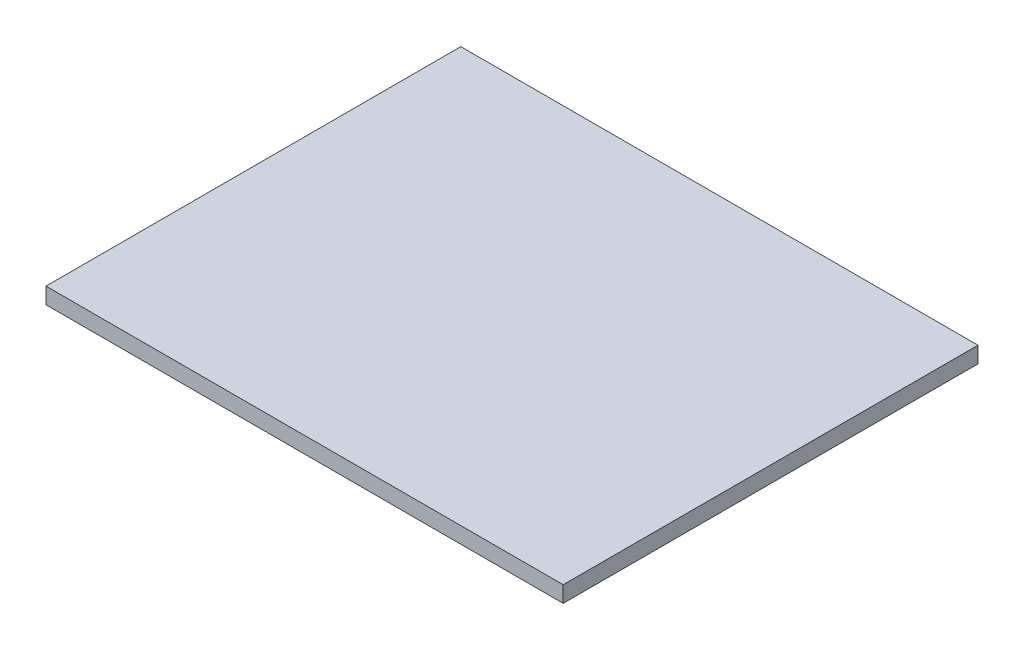
ISO-10303-21;
HEADER;
FILE_DESCRIPTION(('STEP AP214'),'2;1');
FILE_NAME('part.step','',(''),(''),'','','');
FILE_SCHEMA(('AUTOMOTIVE_DESIGN { 1 0 10303 214 1 1 1 1 }'));
ENDSEC;
DATA;
#1=APPLICATION_CONTEXT('core data for automotive mechanical design processes');
#2=APPLICATION_PROTOCOL_DEFINITION('international standard','automotive_design',2000,#1);
#3=PRODUCT_CONTEXT('',#1,'mechanical');
#4=PRODUCT('Part','Part','',(#3));
#5=PRODUCT_RELATED_PRODUCT_CATEGORY('part','',(#4));
#6=PRODUCT_DEFINITION_FORMATION('','',#4);
#7=PRODUCT_DEFINITION_CONTEXT('part definition',#1,'design');
#8=PRODUCT_DEFINITION('design','',#6,#7);
#9=PRODUCT_DEFINITION_SHAPE('','',#8);
#10=(LENGTH_UNIT() NAMED_UNIT(*) SI_UNIT(.MILLI.,.METRE.));
#11=(NAMED_UNIT(*) PLANE_ANGLE_UNIT() SI_UNIT($,.RADIAN.));
#12=(NAMED_UNIT(*) SI_UNIT($,.STERADIAN.) SOLID_ANGLE_UNIT());
#13=UNCERTAINTY_MEASURE_WITH_UNIT(LENGTH_MEASURE(1.E-05),#10,'distance_accuracy_value','');
#14=(GEOMETRIC_REPRESENTATION_CONTEXT(3) GLOBAL_UNCERTAINTY_ASSIGNED_CONTEXT((#13)) GLOBAL_UNIT_ASSIGNED_CONTEXT((#10,
#11,#12)) REPRESENTATION_CONTEXT('',''));
#15=CARTESIAN_POINT('',(0.,0.,0.));
#16=DIRECTION('',(0.,0.,1.));
#17=DIRECTION('',(1.,0.,0.));
#18=AXIS2_PLACEMENT_3D('',#15,#16,#17);
#19=CARTESIAN_POINT('',(0.,0.,0.));
#20=DIRECTION('',(0.,-1.,0.));
#21=DIRECTION('',(0.,0.,-1.));
#22=AXIS2_PLACEMENT_3D('',#19,#20,#21);
#23=PLANE('',#22);
#24=DIRECTION('',(0.,0.,1.));
#25=VECTOR('',#24,1.);
#26=CARTESIAN_POINT('',(-0.762000000000004,0.,0.762000000000004));
#27=LINE('',#26,#25);
#28=CARTESIAN_POINT('',(-0.762000000000004,0.,-18.796));
#29=VERTEX_POINT('',#28);
#30=CARTESIAN_POINT('',(-0.762000000000004,0.,0.762000000000004));
#31=VERTEX_POINT('',#30);
#32=EDGE_CURVE('E182',#29,#31,#27,.T.);
#33=ORIENTED_EDGE('',*,*,#32,.F.);
#34=DIRECTION('',(-1.,0.,0.));
#35=VECTOR('',#34,1.);
#36=CARTESIAN_POINT('',(-0.762000000000004,0.,-18.796));
#37=LINE('',#36,#35);
#38=CARTESIAN_POINT('',(23.622,0.,-18.796));
#39=VERTEX_POINT('',#38);
#40=EDGE_CURVE('E80',#39,#29,#37,.T.);
#41=ORIENTED_EDGE('',*,*,#40,.F.);
#42=DIRECTION('',(0.,0.,-1.));
#43=VECTOR('',#42,1.);
#44=CARTESIAN_POINT('',(23.622,0.,0.762000000000004));
#45=LINE('',#44,#43);
#46=CARTESIAN_POINT('',(23.622,0.,0.762000000000004));
#47=VERTEX_POINT('',#46);
#48=EDGE_CURVE('E199',#47,#39,#45,.T.);
#49=ORIENTED_EDGE('',*,*,#48,.F.);
#50=DIRECTION('',(1.,0.,0.));
#51=VECTOR('',#50,1.);
#52=CARTESIAN_POINT('',(-0.762000000000004,0.,0.762000000000004));
#53=LINE('',#52,#51);
#54=EDGE_CURVE('E185',#31,#47,#53,.T.);
#55=ORIENTED_EDGE('',*,*,#54,.F.);
#56=EDGE_LOOP('',(#33,#41,#49,#55));
#57=FACE_BOUND('',#56,.T.);
#58=DIRECTION('',(1.,0.,0.));
#59=VECTOR('',#58,1.);
#60=CARTESIAN_POINT('',(0.,0.,-5.842));
#61=LINE('',#60,#59);
#62=CARTESIAN_POINT('',(0.,0.,-5.842));
#63=VERTEX_POINT('',#62);
#64=CARTESIAN_POINT('',(0.761999999999998,0.,-5.842));
#65=VERTEX_POINT('',#64);
#66=EDGE_CURVE('E395',#63,#65,#61,.T.);
#67=ORIENTED_EDGE('',*,*,#66,.F.);
#68=DIRECTION('',(0.,0.,-1.));
#69=VECTOR('',#68,1.);
#70=CARTESIAN_POINT('',(0.,0.,0.));
#71=LINE('',#70,#69);
#72=CARTESIAN_POINT('',(0.,0.,0.));
#73=VERTEX_POINT('',#72);
#74=EDGE_CURVE('E180',#73,#63,#71,.T.);
#75=ORIENTED_EDGE('',*,*,#74,.F.);
#76=DIRECTION('',(-1.,0.,0.));
#77=VECTOR('',#76,1.);
#78=CARTESIAN_POINT('',(0.,0.,0.));
#79=LINE('',#78,#77);
#80=CARTESIAN_POINT('',(22.86,0.,0.));
#81=VERTEX_POINT('',#80);
#82=EDGE_CURVE('E176',#81,#73,#79,.T.);
#83=ORIENTED_EDGE('',*,*,#82,.F.);
#84=DIRECTION('',(0.,0.,1.));
#85=VECTOR('',#84,1.);
#86=CARTESIAN_POINT('',(22.86,0.,0.));
#87=LINE('',#86,#85);
#88=CARTESIAN_POINT('',(22.86,0.,-18.034));
#89=VERTEX_POINT('',#88);
#90=EDGE_CURVE('E391',#89,#81,#87,.T.);
#91=ORIENTED_EDGE('',*,*,#90,.F.);
#92=DIRECTION('',(1.,0.,0.));
#93=VECTOR('',#92,1.);
#94=CARTESIAN_POINT('',(22.86,0.,-18.034));
#95=LINE('',#94,#93);
#96=CARTESIAN_POINT('',(0.,0.,-18.034));
#97=VERTEX_POINT('',#96);
#98=EDGE_CURVE('E415',#97,#89,#95,.T.);
#99=ORIENTED_EDGE('',*,*,#98,.F.);
#100=DIRECTION('',(0.,0.,-1.));
#101=VECTOR('',#100,1.);
#102=CARTESIAN_POINT('',(0.,0.,-12.192));
#103=LINE('',#102,#101);
#104=CARTESIAN_POINT('',(0.,0.,-12.192));
#105=VERTEX_POINT('',#104);
#106=EDGE_CURVE('E413',#105,#97,#103,.T.);
#107=ORIENTED_EDGE('',*,*,#106,.F.);
#108=DIRECTION('',(-1.,0.,0.));
#109=VECTOR('',#108,1.);
#110=CARTESIAN_POINT('',(0.,0.,-12.192));
#111=LINE('',#110,#109);
#112=CARTESIAN_POINT('',(0.761999999999998,0.,-12.192));
#113=VERTEX_POINT('',#112);
#114=EDGE_CURVE('E411',#113,#105,#111,.T.);
#115=ORIENTED_EDGE('',*,*,#114,.F.);
#116=DIRECTION('',(0.,0.,1.));
#117=VECTOR('',#116,1.);
#118=CARTESIAN_POINT('',(0.761999999999998,0.,-12.192));
#119=LINE('',#118,#117);
#120=CARTESIAN_POINT('',(0.761999999999999,0.,-17.272));
#121=VERTEX_POINT('',#120);
#122=EDGE_CURVE('E409',#121,#113,#119,.T.);
#123=ORIENTED_EDGE('',*,*,#122,.F.);
#124=DIRECTION('',(-1.,0.,0.));
#125=VECTOR('',#124,1.);
#126=CARTESIAN_POINT('',(0.761999999999999,0.,-17.272));
#127=LINE('',#126,#125);
#128=CARTESIAN_POINT('',(22.098,0.,-17.272));
#129=VERTEX_POINT('',#128);
#130=EDGE_CURVE('E407',#129,#121,#127,.T.);
#131=ORIENTED_EDGE('',*,*,#130,.F.);
#132=DIRECTION('',(0.,0.,-1.));
#133=VECTOR('',#132,1.);
#134=CARTESIAN_POINT('',(22.098,0.,-17.272));
#135=LINE('',#134,#133);
#136=CARTESIAN_POINT('',(22.098,0.,-0.761999999999997));
#137=VERTEX_POINT('',#136);
#138=EDGE_CURVE('E405',#137,#129,#135,.T.);
#139=ORIENTED_EDGE('',*,*,#138,.F.);
#140=DIRECTION('',(1.,0.,0.));
#141=VECTOR('',#140,1.);
#142=CARTESIAN_POINT('',(22.098,0.,-0.761999999999997));
#143=LINE('',#142,#141);
#144=CARTESIAN_POINT('',(0.761999999999998,0.,-0.762));
#145=VERTEX_POINT('',#144);
#146=EDGE_CURVE('E403',#145,#137,#143,.T.);
#147=ORIENTED_EDGE('',*,*,#146,.F.);
#148=DIRECTION('',(0.,0.,1.));
#149=VECTOR('',#148,1.);
#150=CARTESIAN_POINT('',(0.761999999999998,0.,-5.842));
#151=LINE('',#150,#149);
#152=EDGE_CURVE('E397',#65,#145,#151,.T.);
#153=ORIENTED_EDGE('',*,*,#152,.F.);
#154=EDGE_LOOP('',(#67,#75,#83,#91,#99,#107,#115,#123,#131,#139,#147,#153));
#155=FACE_BOUND('',#154,.T.);
#156=ADVANCED_FACE('F35',(#57,#155),#23,.T.);
#157=CARTESIAN_POINT('',(-0.762000000000004,0.762,0.762000000000004));
#158=DIRECTION('',(1.,0.,0.));
#159=DIRECTION('',(0.,0.,-1.));
#160=AXIS2_PLACEMENT_3D('',#157,#158,#159);
#161=PLANE('',#160);
#162=ORIENTED_EDGE('',*,*,#32,.T.);
#163=DIRECTION('',(0.,-1.,0.));
#164=VECTOR('',#163,1.);
#165=CARTESIAN_POINT('',(-0.762000000000004,0.762,0.762000000000004));
#166=LINE('',#165,#164);
#167=CARTESIAN_POINT('',(-0.762000000000004,0.762,0.762000000000004));
#168=VERTEX_POINT('',#167);
#169=EDGE_CURVE('E11',#168,#31,#166,.T.);
#170=ORIENTED_EDGE('',*,*,#169,.F.);
#171=DIRECTION('',(0.,0.,1.));
#172=VECTOR('',#171,1.);
#173=CARTESIAN_POINT('',(-0.762000000000004,0.762,0.762000000000004));
#174=LINE('',#173,#172);
#175=CARTESIAN_POINT('',(-0.762000000000004,0.762,-18.796));
#176=VERTEX_POINT('',#175);
#177=EDGE_CURVE('E191',#176,#168,#174,.T.);
#178=ORIENTED_EDGE('',*,*,#177,.F.);
#179=DIRECTION('',(0.,-1.,0.));
#180=VECTOR('',#179,1.);
#181=CARTESIAN_POINT('',(-0.762000000000004,0.762,-18.796));
#182=LINE('',#181,#180);
#183=EDGE_CURVE('E196',#176,#29,#182,.T.);
#184=ORIENTED_EDGE('',*,*,#183,.T.);
#185=EDGE_LOOP('',(#162,#170,#178,#184));
#186=FACE_BOUND('',#185,.T.);
#187=ADVANCED_FACE('F37',(#186),#161,.F.);
#188=CARTESIAN_POINT('',(-0.762000000000004,0.762,0.762000000000004));
#189=DIRECTION('',(0.,0.,-1.));
#190=DIRECTION('',(-1.,0.,0.));
#191=AXIS2_PLACEMENT_3D('',#188,#189,#190);
#192=PLANE('',#191);
#193=ORIENTED_EDGE('',*,*,#54,.T.);
#194=DIRECTION('',(0.,-1.,0.));
#195=VECTOR('',#194,1.);
#196=CARTESIAN_POINT('',(23.622,0.762,0.762000000000004));
#197=LINE('',#196,#195);
#198=CARTESIAN_POINT('',(23.622,0.762,0.762000000000004));
#199=VERTEX_POINT('',#198);
#200=EDGE_CURVE('E43',#199,#47,#197,.T.);
#201=ORIENTED_EDGE('',*,*,#200,.F.);
#202=DIRECTION('',(1.,0.,0.));
#203=VECTOR('',#202,1.);
#204=CARTESIAN_POINT('',(-0.762000000000004,0.762,0.762000000000004));
#205=LINE('',#204,#203);
#206=EDGE_CURVE('E87',#168,#199,#205,.T.);
#207=ORIENTED_EDGE('',*,*,#206,.F.);
#208=ORIENTED_EDGE('',*,*,#169,.T.);
#209=EDGE_LOOP('',(#193,#201,#207,#208));
#210=FACE_BOUND('',#209,.T.);
#211=ADVANCED_FACE('F225',(#210),#192,.F.);
#212=CARTESIAN_POINT('',(23.622,0.762,0.762000000000004));
#213=DIRECTION('',(-1.,0.,0.));
#214=DIRECTION('',(0.,0.,1.));
#215=AXIS2_PLACEMENT_3D('',#212,#213,#214);
#216=PLANE('',#215);
#217=ORIENTED_EDGE('',*,*,#48,.T.);
#218=DIRECTION('',(0.,-1.,0.));
#219=VECTOR('',#218,1.);
#220=CARTESIAN_POINT('',(23.622,0.762,-18.796));
#221=LINE('',#220,#219);
#222=CARTESIAN_POINT('',(23.622,0.762,-18.796));
#223=VERTEX_POINT('',#222);
#224=EDGE_CURVE('E203',#223,#39,#221,.T.);
#225=ORIENTED_EDGE('',*,*,#224,.F.);
#226=DIRECTION('',(0.,0.,-1.));
#227=VECTOR('',#226,1.);
#228=CARTESIAN_POINT('',(23.622,0.762,0.762000000000004));
#229=LINE('',#228,#227);
#230=EDGE_CURVE('E194',#199,#223,#229,.T.);
#231=ORIENTED_EDGE('',*,*,#230,.F.);
#232=ORIENTED_EDGE('',*,*,#200,.T.);
#233=EDGE_LOOP('',(#217,#225,#231,#232));
#234=FACE_BOUND('',#233,.T.);
#235=ADVANCED_FACE('F208',(#234),#216,.F.);
#236=CARTESIAN_POINT('',(-0.762000000000004,0.762,-18.796));
#237=DIRECTION('',(0.,0.,1.));
#238=DIRECTION('',(1.,0.,0.));
#239=AXIS2_PLACEMENT_3D('',#236,#237,#238);
#240=PLANE('',#239);
#241=ORIENTED_EDGE('',*,*,#40,.T.);
#242=ORIENTED_EDGE('',*,*,#183,.F.);
#243=DIRECTION('',(-1.,0.,0.));
#244=VECTOR('',#243,1.);
#245=CARTESIAN_POINT('',(-0.762000000000004,0.762,-18.796));
#246=LINE('',#245,#244);
#247=EDGE_CURVE('E59',#223,#176,#246,.T.);
#248=ORIENTED_EDGE('',*,*,#247,.F.);
#249=ORIENTED_EDGE('',*,*,#224,.T.);
#250=EDGE_LOOP('',(#241,#242,#248,#249));
#251=FACE_BOUND('',#250,.T.);
#252=ADVANCED_FACE('F216',(#251),#240,.F.);
#253=CARTESIAN_POINT('',(0.,0.762,0.));
#254=DIRECTION('',(0.,-1.,0.));
#255=DIRECTION('',(0.,0.,-1.));
#256=AXIS2_PLACEMENT_3D('',#253,#254,#255);
#257=PLANE('',#256);
#258=ORIENTED_EDGE('',*,*,#177,.T.);
#259=ORIENTED_EDGE('',*,*,#206,.T.);
#260=ORIENTED_EDGE('',*,*,#230,.T.);
#261=ORIENTED_EDGE('',*,*,#247,.T.);
#262=EDGE_LOOP('',(#258,#259,#260,#261));
#263=FACE_BOUND('',#262,.T.);
#264=ADVANCED_FACE('F218',(#263),#257,.F.);
#265=CARTESIAN_POINT('',(0.,-0.762,0.));
#266=DIRECTION('',(1.,0.,0.));
#267=DIRECTION('',(0.,0.,-1.));
#268=AXIS2_PLACEMENT_3D('',#265,#266,#267);
#269=PLANE('',#268);
#270=ORIENTED_EDGE('',*,*,#74,.T.);
#271=DIRECTION('',(0.,1.,0.));
#272=VECTOR('',#271,1.);
#273=CARTESIAN_POINT('',(0.,-0.762,-5.842));
#274=LINE('',#273,#272);
#275=CARTESIAN_POINT('',(0.,-0.762,-5.842));
#276=VERTEX_POINT('',#275);
#277=EDGE_CURVE('E161',#276,#63,#274,.T.);
#278=ORIENTED_EDGE('',*,*,#277,.F.);
#279=DIRECTION('',(0.,0.,-1.));
#280=VECTOR('',#279,1.);
#281=CARTESIAN_POINT('',(0.,-0.762,0.));
#282=LINE('',#281,#280);
#283=CARTESIAN_POINT('',(0.,-0.762,0.));
#284=VERTEX_POINT('',#283);
#285=EDGE_CURVE('E168',#284,#276,#282,.T.);
#286=ORIENTED_EDGE('',*,*,#285,.F.);
#287=DIRECTION('',(0.,1.,0.));
#288=VECTOR('',#287,1.);
#289=CARTESIAN_POINT('',(0.,-0.762,0.));
#290=LINE('',#289,#288);
#291=EDGE_CURVE('E389',#284,#73,#290,.T.);
#292=ORIENTED_EDGE('',*,*,#291,.T.);
#293=EDGE_LOOP('',(#270,#278,#286,#292));
#294=FACE_BOUND('',#293,.T.);
#295=ADVANCED_FACE('F178',(#294),#269,.F.);
#296=CARTESIAN_POINT('',(0.,-0.762,-5.842));
#297=DIRECTION('',(0.,0.,1.));
#298=DIRECTION('',(1.,0.,0.));
#299=AXIS2_PLACEMENT_3D('',#296,#297,#298);
#300=PLANE('',#299);
#301=ORIENTED_EDGE('',*,*,#66,.T.);
#302=DIRECTION('',(0.,1.,0.));
#303=VECTOR('',#302,1.);
#304=CARTESIAN_POINT('',(0.761999999999998,-0.762,-5.842));
#305=LINE('',#304,#303);
#306=CARTESIAN_POINT('',(0.761999999999998,-0.762,-5.842));
#307=VERTEX_POINT('',#306);
#308=EDGE_CURVE('E164',#307,#65,#305,.T.);
#309=ORIENTED_EDGE('',*,*,#308,.F.);
#310=DIRECTION('',(1.,0.,0.));
#311=VECTOR('',#310,1.);
#312=CARTESIAN_POINT('',(0.,-0.762,-5.842));
#313=LINE('',#312,#311);
#314=EDGE_CURVE('E157',#276,#307,#313,.T.);
#315=ORIENTED_EDGE('',*,*,#314,.F.);
#316=ORIENTED_EDGE('',*,*,#277,.T.);
#317=EDGE_LOOP('',(#301,#309,#315,#316));
#318=FACE_BOUND('',#317,.T.);
#319=ADVANCED_FACE('F159',(#318),#300,.F.);
#320=CARTESIAN_POINT('',(0.761999999999998,-0.762,-5.842));
#321=DIRECTION('',(-1.,0.,0.));
#322=DIRECTION('',(0.,0.,1.));
#323=AXIS2_PLACEMENT_3D('',#320,#321,#322);
#324=PLANE('',#323);
#325=ORIENTED_EDGE('',*,*,#152,.T.);
#326=DIRECTION('',(0.,1.,0.));
#327=VECTOR('',#326,1.);
#328=CARTESIAN_POINT('',(0.761999999999998,-0.762,-0.762));
#329=LINE('',#328,#327);
#330=CARTESIAN_POINT('',(0.761999999999998,-0.762,-0.762));
#331=VERTEX_POINT('',#330);
#332=EDGE_CURVE('E187',#331,#145,#329,.T.);
#333=ORIENTED_EDGE('',*,*,#332,.F.);
#334=DIRECTION('',(0.,0.,1.));
#335=VECTOR('',#334,1.);
#336=CARTESIAN_POINT('',(0.761999999999998,-0.762,-5.842));
#337=LINE('',#336,#335);
#338=EDGE_CURVE('E167',#307,#331,#337,.T.);
#339=ORIENTED_EDGE('',*,*,#338,.F.);
#340=ORIENTED_EDGE('',*,*,#308,.T.);
#341=EDGE_LOOP('',(#325,#333,#339,#340));
#342=FACE_BOUND('',#341,.T.);
#343=ADVANCED_FACE('F237',(#342),#324,.F.);
#344=CARTESIAN_POINT('',(22.098,-0.762,-0.761999999999997));
#345=DIRECTION('',(0.,0.,1.));
#346=DIRECTION('',(1.,0.,0.));
#347=AXIS2_PLACEMENT_3D('',#344,#345,#346);
#348=PLANE('',#347);
#349=ORIENTED_EDGE('',*,*,#146,.T.);
#350=DIRECTION('',(0.,1.,0.));
#351=VECTOR('',#350,1.);
#352=CARTESIAN_POINT('',(22.098,-0.762,-0.761999999999997));
#353=LINE('',#352,#351);
#354=CARTESIAN_POINT('',(22.098,-0.762,-0.761999999999997));
#355=VERTEX_POINT('',#354);
#356=EDGE_CURVE('E437',#355,#137,#353,.T.);
#357=ORIENTED_EDGE('',*,*,#356,.F.);
#358=DIRECTION('',(1.,0.,0.));
#359=VECTOR('',#358,1.);
#360=CARTESIAN_POINT('',(22.098,-0.762,-0.761999999999997));
#361=LINE('',#360,#359);
#362=EDGE_CURVE('E444',#331,#355,#361,.T.);
#363=ORIENTED_EDGE('',*,*,#362,.F.);
#364=ORIENTED_EDGE('',*,*,#332,.T.);
#365=EDGE_LOOP('',(#349,#357,#363,#364));
#366=FACE_BOUND('',#365,.T.);
#367=ADVANCED_FACE('F240',(#366),#348,.F.);
#368=CARTESIAN_POINT('',(22.098,-0.762,-17.272));
#369=DIRECTION('',(1.,0.,0.));
#370=DIRECTION('',(0.,0.,-1.));
#371=AXIS2_PLACEMENT_3D('',#368,#369,#370);
#372=PLANE('',#371);
#373=ORIENTED_EDGE('',*,*,#138,.T.);
#374=DIRECTION('',(0.,1.,0.));
#375=VECTOR('',#374,1.);
#376=CARTESIAN_POINT('',(22.098,-0.762,-17.272));
#377=LINE('',#376,#375);
#378=CARTESIAN_POINT('',(22.098,-0.762,-17.272));
#379=VERTEX_POINT('',#378);
#380=EDGE_CURVE('E434',#379,#129,#377,.T.);
#381=ORIENTED_EDGE('',*,*,#380,.F.);
#382=DIRECTION('',(0.,0.,-1.));
#383=VECTOR('',#382,1.);
#384=CARTESIAN_POINT('',(22.098,-0.762,-17.272));
#385=LINE('',#384,#383);
#386=EDGE_CURVE('E455',#355,#379,#385,.T.);
#387=ORIENTED_EDGE('',*,*,#386,.F.);
#388=ORIENTED_EDGE('',*,*,#356,.T.);
#389=EDGE_LOOP('',(#373,#381,#387,#388));
#390=FACE_BOUND('',#389,.T.);
#391=ADVANCED_FACE('F244',(#390),#372,.F.);
#392=CARTESIAN_POINT('',(0.761999999999999,-0.762,-17.272));
#393=DIRECTION('',(0.,0.,-1.));
#394=DIRECTION('',(-1.,0.,0.));
#395=AXIS2_PLACEMENT_3D('',#392,#393,#394);
#396=PLANE('',#395);
#397=ORIENTED_EDGE('',*,*,#130,.T.);
#398=DIRECTION('',(0.,1.,0.));
#399=VECTOR('',#398,1.);
#400=CARTESIAN_POINT('',(0.761999999999999,-0.762,-17.272));
#401=LINE('',#400,#399);
#402=CARTESIAN_POINT('',(0.761999999999999,-0.762,-17.272));
#403=VERTEX_POINT('',#402);
#404=EDGE_CURVE('E431',#403,#121,#401,.T.);
#405=ORIENTED_EDGE('',*,*,#404,.F.);
#406=DIRECTION('',(-1.,0.,0.));
#407=VECTOR('',#406,1.);
#408=CARTESIAN_POINT('',(0.761999999999999,-0.762,-17.272));
#409=LINE('',#408,#407);
#410=EDGE_CURVE('E452',#379,#403,#409,.T.);
#411=ORIENTED_EDGE('',*,*,#410,.F.);
#412=ORIENTED_EDGE('',*,*,#380,.T.);
#413=EDGE_LOOP('',(#397,#405,#411,#412));
#414=FACE_BOUND('',#413,.T.);
#415=ADVANCED_FACE('F248',(#414),#396,.F.);
#416=CARTESIAN_POINT('',(0.761999999999998,-0.762,-12.192));
#417=DIRECTION('',(-1.,0.,0.));
#418=DIRECTION('',(0.,0.,1.));
#419=AXIS2_PLACEMENT_3D('',#416,#417,#418);
#420=PLANE('',#419);
#421=ORIENTED_EDGE('',*,*,#122,.T.);
#422=DIRECTION('',(0.,1.,0.));
#423=VECTOR('',#422,1.);
#424=CARTESIAN_POINT('',(0.761999999999998,-0.762,-12.192));
#425=LINE('',#424,#423);
#426=CARTESIAN_POINT('',(0.761999999999998,-0.762,-12.192));
#427=VERTEX_POINT('',#426);
#428=EDGE_CURVE('E428',#427,#113,#425,.T.);
#429=ORIENTED_EDGE('',*,*,#428,.F.);
#430=DIRECTION('',(0.,0.,1.));
#431=VECTOR('',#430,1.);
#432=CARTESIAN_POINT('',(0.761999999999998,-0.762,-12.192));
#433=LINE('',#432,#431);
#434=EDGE_CURVE('E454',#403,#427,#433,.T.);
#435=ORIENTED_EDGE('',*,*,#434,.F.);
#436=ORIENTED_EDGE('',*,*,#404,.T.);
#437=EDGE_LOOP('',(#421,#429,#435,#436));
#438=FACE_BOUND('',#437,.T.);
#439=ADVANCED_FACE('F252',(#438),#420,.F.);
#440=CARTESIAN_POINT('',(0.,-0.762,-12.192));
#441=DIRECTION('',(0.,0.,-1.));
#442=DIRECTION('',(-1.,0.,0.));
#443=AXIS2_PLACEMENT_3D('',#440,#441,#442);
#444=PLANE('',#443);
#445=ORIENTED_EDGE('',*,*,#114,.T.);
#446=DIRECTION('',(0.,1.,0.));
#447=VECTOR('',#446,1.);
#448=CARTESIAN_POINT('',(0.,-0.762,-12.192));
#449=LINE('',#448,#447);
#450=CARTESIAN_POINT('',(0.,-0.762,-12.192));
#451=VERTEX_POINT('',#450);
#452=EDGE_CURVE('E425',#451,#105,#449,.T.);
#453=ORIENTED_EDGE('',*,*,#452,.F.);
#454=DIRECTION('',(-1.,0.,0.));
#455=VECTOR('',#454,1.);
#456=CARTESIAN_POINT('',(0.,-0.762,-12.192));
#457=LINE('',#456,#455);
#458=EDGE_CURVE('E457',#427,#451,#457,.T.);
#459=ORIENTED_EDGE('',*,*,#458,.F.);
#460=ORIENTED_EDGE('',*,*,#428,.T.);
#461=EDGE_LOOP('',(#445,#453,#459,#460));
#462=FACE_BOUND('',#461,.T.);
#463=ADVANCED_FACE('F256',(#462),#444,.F.);
#464=CARTESIAN_POINT('',(0.,-0.762,-12.192));
#465=DIRECTION('',(1.,0.,0.));
#466=DIRECTION('',(0.,0.,-1.));
#467=AXIS2_PLACEMENT_3D('',#464,#465,#466);
#468=PLANE('',#467);
#469=ORIENTED_EDGE('',*,*,#106,.T.);
#470=DIRECTION('',(0.,1.,0.));
#471=VECTOR('',#470,1.);
#472=CARTESIAN_POINT('',(0.,-0.762,-18.034));
#473=LINE('',#472,#471);
#474=CARTESIAN_POINT('',(0.,-0.762,-18.034));
#475=VERTEX_POINT('',#474);
#476=EDGE_CURVE('E422',#475,#97,#473,.T.);
#477=ORIENTED_EDGE('',*,*,#476,.F.);
#478=DIRECTION('',(0.,0.,-1.));
#479=VECTOR('',#478,1.);
#480=CARTESIAN_POINT('',(0.,-0.762,-12.192));
#481=LINE('',#480,#479);
#482=EDGE_CURVE('E463',#451,#475,#481,.T.);
#483=ORIENTED_EDGE('',*,*,#482,.F.);
#484=ORIENTED_EDGE('',*,*,#452,.T.);
#485=EDGE_LOOP('',(#469,#477,#483,#484));
#486=FACE_BOUND('',#485,.T.);
#487=ADVANCED_FACE('F260',(#486),#468,.F.);
#488=CARTESIAN_POINT('',(22.86,-0.762,-18.034));
#489=DIRECTION('',(0.,0.,1.));
#490=DIRECTION('',(1.,0.,0.));
#491=AXIS2_PLACEMENT_3D('',#488,#489,#490);
#492=PLANE('',#491);
#493=ORIENTED_EDGE('',*,*,#98,.T.);
#494=DIRECTION('',(0.,1.,0.));
#495=VECTOR('',#494,1.);
#496=CARTESIAN_POINT('',(22.86,-0.762,-18.034));
#497=LINE('',#496,#495);
#498=CARTESIAN_POINT('',(22.86,-0.762,-18.034));
#499=VERTEX_POINT('',#498);
#500=EDGE_CURVE('E419',#499,#89,#497,.T.);
#501=ORIENTED_EDGE('',*,*,#500,.F.);
#502=DIRECTION('',(1.,0.,0.));
#503=VECTOR('',#502,1.);
#504=CARTESIAN_POINT('',(22.86,-0.762,-18.034));
#505=LINE('',#504,#503);
#506=EDGE_CURVE('E465',#475,#499,#505,.T.);
#507=ORIENTED_EDGE('',*,*,#506,.F.);
#508=ORIENTED_EDGE('',*,*,#476,.T.);
#509=EDGE_LOOP('',(#493,#501,#507,#508));
#510=FACE_BOUND('',#509,.T.);
#511=ADVANCED_FACE('F264',(#510),#492,.F.);
#512=CARTESIAN_POINT('',(22.86,-0.762,0.));
#513=DIRECTION('',(-1.,0.,0.));
#514=DIRECTION('',(0.,0.,1.));
#515=AXIS2_PLACEMENT_3D('',#512,#513,#514);
#516=PLANE('',#515);
#517=ORIENTED_EDGE('',*,*,#90,.T.);
#518=DIRECTION('',(0.,1.,0.));
#519=VECTOR('',#518,1.);
#520=CARTESIAN_POINT('',(22.86,-0.762,0.));
#521=LINE('',#520,#519);
#522=CARTESIAN_POINT('',(22.86,-0.762,0.));
#523=VERTEX_POINT('',#522);
#524=EDGE_CURVE('E50',#523,#81,#521,.T.);
#525=ORIENTED_EDGE('',*,*,#524,.F.);
#526=DIRECTION('',(0.,0.,1.));
#527=VECTOR('',#526,1.);
#528=CARTESIAN_POINT('',(22.86,-0.762,0.));
#529=LINE('',#528,#527);
#530=EDGE_CURVE('E466',#499,#523,#529,.T.);
#531=ORIENTED_EDGE('',*,*,#530,.F.);
#532=ORIENTED_EDGE('',*,*,#500,.T.);
#533=EDGE_LOOP('',(#517,#525,#531,#532));
#534=FACE_BOUND('',#533,.T.);
#535=ADVANCED_FACE('F268',(#534),#516,.F.);
#536=CARTESIAN_POINT('',(0.,-0.762,0.));
#537=DIRECTION('',(0.,0.,-1.));
#538=DIRECTION('',(-1.,0.,0.));
#539=AXIS2_PLACEMENT_3D('',#536,#537,#538);
#540=PLANE('',#539);
#541=ORIENTED_EDGE('',*,*,#82,.T.);
#542=ORIENTED_EDGE('',*,*,#291,.F.);
#543=DIRECTION('',(-1.,0.,0.));
#544=VECTOR('',#543,1.);
#545=CARTESIAN_POINT('',(0.,-0.762,0.));
#546=LINE('',#545,#544);
#547=EDGE_CURVE('E172',#523,#284,#546,.T.);
#548=ORIENTED_EDGE('',*,*,#547,.F.);
#549=ORIENTED_EDGE('',*,*,#524,.T.);
#550=EDGE_LOOP('',(#541,#542,#548,#549));
#551=FACE_BOUND('',#550,.T.);
#552=ADVANCED_FACE('F272',(#551),#540,.F.);
#553=CARTESIAN_POINT('',(0.,-0.762,0.));
#554=DIRECTION('',(0.,-1.,0.));
#555=DIRECTION('',(0.,0.,-1.));
#556=AXIS2_PLACEMENT_3D('',#553,#554,#555);
#557=PLANE('',#556);
#558=ORIENTED_EDGE('',*,*,#285,.T.);
#559=ORIENTED_EDGE('',*,*,#314,.T.);
#560=ORIENTED_EDGE('',*,*,#338,.T.);
#561=ORIENTED_EDGE('',*,*,#362,.T.);
#562=ORIENTED_EDGE('',*,*,#386,.T.);
#563=ORIENTED_EDGE('',*,*,#410,.T.);
#564=ORIENTED_EDGE('',*,*,#434,.T.);
#565=ORIENTED_EDGE('',*,*,#458,.T.);
#566=ORIENTED_EDGE('',*,*,#482,.T.);
#567=ORIENTED_EDGE('',*,*,#506,.T.);
#568=ORIENTED_EDGE('',*,*,#530,.T.);
#569=ORIENTED_EDGE('',*,*,#547,.T.);
#570=EDGE_LOOP('',(#558,#559,#560,#561,#562,#563,#564,#565,#566,#567,#568,#569));
#571=FACE_BOUND('',#570,.T.);
#572=ADVANCED_FACE('F171',(#571),#557,.T.);
#573=CLOSED_SHELL('',(#156,#187,#211,#235,#252,#264,#295,#319,#343,#367,#391,#415,#439,#463,
#487,#511,#535,#552,#572));
#574=MANIFOLD_SOLID_BREP('B2',#573);
#575=ADVANCED_BREP_SHAPE_REPRESENTATION('',(#18,#574),#14);
#576=SHAPE_DEFINITION_REPRESENTATION(#9,#575);
ENDSEC;
END-ISO-10303-21;
